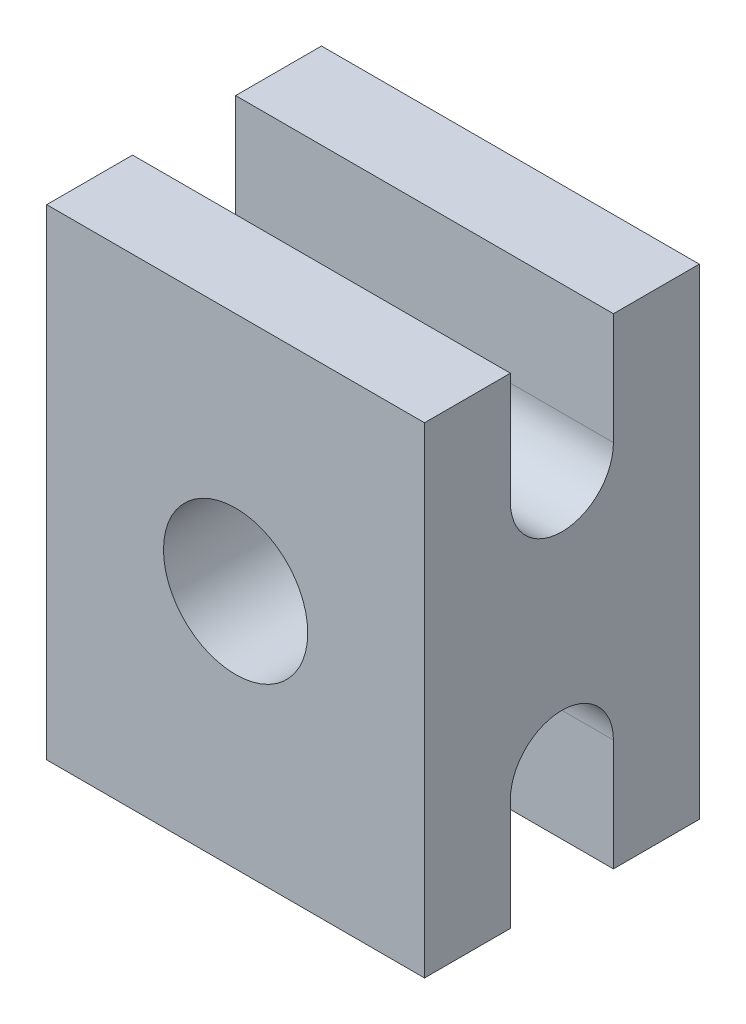
ISO-10303-21;
HEADER;
FILE_DESCRIPTION(('STEP AP214'),'2;1');
FILE_NAME('part.step','',(''),(''),'','','');
FILE_SCHEMA(('AUTOMOTIVE_DESIGN { 1 0 10303 214 1 1 1 1 }'));
ENDSEC;
DATA;
#1=APPLICATION_CONTEXT('core data for automotive mechanical design processes');
#2=APPLICATION_PROTOCOL_DEFINITION('international standard','automotive_design',2000,#1);
#3=PRODUCT_CONTEXT('',#1,'mechanical');
#4=PRODUCT('Part','Part','',(#3));
#5=PRODUCT_RELATED_PRODUCT_CATEGORY('part','',(#4));
#6=PRODUCT_DEFINITION_FORMATION('','',#4);
#7=PRODUCT_DEFINITION_CONTEXT('part definition',#1,'design');
#8=PRODUCT_DEFINITION('design','',#6,#7);
#9=PRODUCT_DEFINITION_SHAPE('','',#8);
#10=(LENGTH_UNIT() NAMED_UNIT(*) SI_UNIT(.MILLI.,.METRE.));
#11=(NAMED_UNIT(*) PLANE_ANGLE_UNIT() SI_UNIT($,.RADIAN.));
#12=(NAMED_UNIT(*) SI_UNIT($,.STERADIAN.) SOLID_ANGLE_UNIT());
#13=UNCERTAINTY_MEASURE_WITH_UNIT(LENGTH_MEASURE(1.E-05),#10,'distance_accuracy_value','');
#14=(GEOMETRIC_REPRESENTATION_CONTEXT(3) GLOBAL_UNCERTAINTY_ASSIGNED_CONTEXT((#13)) GLOBAL_UNIT_ASSIGNED_CONTEXT((#10,
#11,#12)) REPRESENTATION_CONTEXT('',''));
#15=CARTESIAN_POINT('',(0.,0.,0.));
#16=DIRECTION('',(0.,0.,1.));
#17=DIRECTION('',(1.,0.,0.));
#18=AXIS2_PLACEMENT_3D('',#15,#16,#17);
#19=CARTESIAN_POINT('',(0.,0.,8.));
#20=DIRECTION('',(0.,1.,0.));
#21=DIRECTION('',(0.,0.,1.));
#22=AXIS2_PLACEMENT_3D('',#19,#20,#21);
#23=PLANE('',#22);
#24=DIRECTION('',(0.,0.,-1.));
#25=VECTOR('',#24,1.);
#26=CARTESIAN_POINT('',(11.,0.,8.));
#27=LINE('',#26,#25);
#28=CARTESIAN_POINT('',(11.,0.,2.5));
#29=VERTEX_POINT('',#28);
#30=CARTESIAN_POINT('',(11.,0.,0.));
#31=VERTEX_POINT('',#30);
#32=EDGE_CURVE('E207',#29,#31,#27,.T.);
#33=ORIENTED_EDGE('',*,*,#32,.F.);
#34=DIRECTION('',(-1.,0.,0.));
#35=VECTOR('',#34,1.);
#36=CARTESIAN_POINT('',(0.,0.,2.5));
#37=LINE('',#36,#35);
#38=CARTESIAN_POINT('',(0.,0.,2.5));
#39=VERTEX_POINT('',#38);
#40=EDGE_CURVE('E146',#29,#39,#37,.T.);
#41=ORIENTED_EDGE('',*,*,#40,.T.);
#42=DIRECTION('',(0.,0.,-1.));
#43=VECTOR('',#42,1.);
#44=CARTESIAN_POINT('',(0.,0.,8.));
#45=LINE('',#44,#43);
#46=CARTESIAN_POINT('',(0.,0.,0.));
#47=VERTEX_POINT('',#46);
#48=EDGE_CURVE('E209',#39,#47,#45,.T.);
#49=ORIENTED_EDGE('',*,*,#48,.T.);
#50=DIRECTION('',(1.,0.,0.));
#51=VECTOR('',#50,1.);
#52=CARTESIAN_POINT('',(0.,0.,0.));
#53=LINE('',#52,#51);
#54=EDGE_CURVE('E192',#47,#31,#53,.T.);
#55=ORIENTED_EDGE('',*,*,#54,.T.);
#56=EDGE_LOOP('',(#33,#41,#49,#55));
#57=FACE_BOUND('',#56,.T.);
#58=ADVANCED_FACE('F30',(#57),#23,.F.);
#59=CARTESIAN_POINT('',(0.,14.,8.));
#60=DIRECTION('',(0.,-1.,0.));
#61=DIRECTION('',(1.,0.,0.));
#62=AXIS2_PLACEMENT_3D('',#59,#60,#61);
#63=PLANE('',#62);
#64=DIRECTION('',(0.,0.,-1.));
#65=VECTOR('',#64,1.);
#66=CARTESIAN_POINT('',(11.,14.,8.));
#67=LINE('',#66,#65);
#68=CARTESIAN_POINT('',(11.,14.,8.));
#69=VERTEX_POINT('',#68);
#70=CARTESIAN_POINT('',(11.,14.,5.5));
#71=VERTEX_POINT('',#70);
#72=EDGE_CURVE('E204',#69,#71,#67,.T.);
#73=ORIENTED_EDGE('',*,*,#72,.T.);
#74=DIRECTION('',(-1.,0.,0.));
#75=VECTOR('',#74,1.);
#76=CARTESIAN_POINT('',(0.,14.,5.5));
#77=LINE('',#76,#75);
#78=CARTESIAN_POINT('',(0.,14.,5.5));
#79=VERTEX_POINT('',#78);
#80=EDGE_CURVE('E38',#71,#79,#77,.T.);
#81=ORIENTED_EDGE('',*,*,#80,.T.);
#82=DIRECTION('',(0.,0.,-1.));
#83=VECTOR('',#82,1.);
#84=CARTESIAN_POINT('',(0.,14.,8.));
#85=LINE('',#84,#83);
#86=CARTESIAN_POINT('',(0.,14.,8.));
#87=VERTEX_POINT('',#86);
#88=EDGE_CURVE('E200',#87,#79,#85,.T.);
#89=ORIENTED_EDGE('',*,*,#88,.F.);
#90=DIRECTION('',(-1.,0.,0.));
#91=VECTOR('',#90,1.);
#92=CARTESIAN_POINT('',(0.,14.,8.));
#93=LINE('',#92,#91);
#94=EDGE_CURVE('E187',#69,#87,#93,.T.);
#95=ORIENTED_EDGE('',*,*,#94,.F.);
#96=EDGE_LOOP('',(#73,#81,#89,#95));
#97=FACE_BOUND('',#96,.T.);
#98=ADVANCED_FACE('F217',(#97),#63,.F.);
#99=CARTESIAN_POINT('',(0.,0.,8.));
#100=DIRECTION('',(0.,0.,-1.));
#101=DIRECTION('',(-1.,0.,0.));
#102=AXIS2_PLACEMENT_3D('',#99,#100,#101);
#103=PLANE('',#102);
#104=DIRECTION('',(0.,-1.,0.));
#105=VECTOR('',#104,1.);
#106=CARTESIAN_POINT('',(0.,0.,8.));
#107=LINE('',#106,#105);
#108=CARTESIAN_POINT('',(0.,0.,8.));
#109=VERTEX_POINT('',#108);
#110=EDGE_CURVE('E179',#87,#109,#107,.T.);
#111=ORIENTED_EDGE('',*,*,#110,.T.);
#112=DIRECTION('',(1.,0.,0.));
#113=VECTOR('',#112,1.);
#114=CARTESIAN_POINT('',(0.,0.,8.));
#115=LINE('',#114,#113);
#116=CARTESIAN_POINT('',(11.,0.,8.));
#117=VERTEX_POINT('',#116);
#118=EDGE_CURVE('E182',#109,#117,#115,.T.);
#119=ORIENTED_EDGE('',*,*,#118,.T.);
#120=DIRECTION('',(0.,1.,0.));
#121=VECTOR('',#120,1.);
#122=CARTESIAN_POINT('',(11.,0.,8.));
#123=LINE('',#122,#121);
#124=EDGE_CURVE('E185',#117,#69,#123,.T.);
#125=ORIENTED_EDGE('',*,*,#124,.T.);
#126=ORIENTED_EDGE('',*,*,#94,.T.);
#127=EDGE_LOOP('',(#111,#119,#125,#126));
#128=FACE_BOUND('',#127,.T.);
#129=CARTESIAN_POINT('',(5.5,7.,8.));
#130=DIRECTION('',(0.,0.,1.));
#131=DIRECTION('',(1.,0.,0.));
#132=AXIS2_PLACEMENT_3D('',#129,#130,#131);
#133=CIRCLE('',#132,2.1);
#134=CARTESIAN_POINT('',(7.6,7.,8.));
#135=VERTEX_POINT('',#134);
#136=EDGE_CURVE('E173',#135,#135,#133,.T.);
#137=ORIENTED_EDGE('',*,*,#136,.F.);
#138=EDGE_LOOP('',(#137));
#139=FACE_BOUND('',#138,.T.);
#140=ADVANCED_FACE('F227',(#128,#139),#103,.F.);
#141=CARTESIAN_POINT('',(0.,0.,0.));
#142=DIRECTION('',(0.,0.,-1.));
#143=DIRECTION('',(-1.,0.,0.));
#144=AXIS2_PLACEMENT_3D('',#141,#142,#143);
#145=PLANE('',#144);
#146=DIRECTION('',(0.,-1.,0.));
#147=VECTOR('',#146,1.);
#148=CARTESIAN_POINT('',(0.,0.,0.));
#149=LINE('',#148,#147);
#150=CARTESIAN_POINT('',(0.,14.,0.));
#151=VERTEX_POINT('',#150);
#152=EDGE_CURVE('E176',#151,#47,#149,.T.);
#153=ORIENTED_EDGE('',*,*,#152,.F.);
#154=DIRECTION('',(-1.,0.,0.));
#155=VECTOR('',#154,1.);
#156=CARTESIAN_POINT('',(0.,14.,0.));
#157=LINE('',#156,#155);
#158=CARTESIAN_POINT('',(11.,14.,0.));
#159=VERTEX_POINT('',#158);
#160=EDGE_CURVE('E183',#159,#151,#157,.T.);
#161=ORIENTED_EDGE('',*,*,#160,.F.);
#162=DIRECTION('',(0.,1.,0.));
#163=VECTOR('',#162,1.);
#164=CARTESIAN_POINT('',(11.,0.,0.));
#165=LINE('',#164,#163);
#166=EDGE_CURVE('E195',#31,#159,#165,.T.);
#167=ORIENTED_EDGE('',*,*,#166,.F.);
#168=ORIENTED_EDGE('',*,*,#54,.F.);
#169=EDGE_LOOP('',(#153,#161,#167,#168));
#170=FACE_BOUND('',#169,.T.);
#171=CARTESIAN_POINT('',(5.5,7.,0.));
#172=DIRECTION('',(0.,0.,1.));
#173=DIRECTION('',(1.,0.,0.));
#174=AXIS2_PLACEMENT_3D('',#171,#172,#173);
#175=CIRCLE('',#174,2.1);
#176=CARTESIAN_POINT('',(7.6,7.,0.));
#177=VERTEX_POINT('',#176);
#178=EDGE_CURVE('E172',#177,#177,#175,.T.);
#179=ORIENTED_EDGE('',*,*,#178,.T.);
#180=EDGE_LOOP('',(#179));
#181=FACE_BOUND('',#180,.T.);
#182=ADVANCED_FACE('F244',(#170,#181),#145,.T.);
#183=CARTESIAN_POINT('',(0.,0.,8.));
#184=DIRECTION('',(1.,0.,0.));
#185=DIRECTION('',(0.,0.,-1.));
#186=AXIS2_PLACEMENT_3D('',#183,#184,#185);
#187=PLANE('',#186);
#188=ORIENTED_EDGE('',*,*,#48,.F.);
#189=DIRECTION('',(0.,1.,0.));
#190=VECTOR('',#189,1.);
#191=CARTESIAN_POINT('',(0.,0.,2.5));
#192=LINE('',#191,#190);
#193=CARTESIAN_POINT('',(0.,3.25,2.49999999999999));
#194=VERTEX_POINT('',#193);
#195=EDGE_CURVE('E149',#39,#194,#192,.T.);
#196=ORIENTED_EDGE('',*,*,#195,.T.);
#197=CARTESIAN_POINT('',(0.,3.25,4.));
#198=DIRECTION('',(1.,0.,0.));
#199=DIRECTION('',(0.,0.,-1.));
#200=AXIS2_PLACEMENT_3D('',#197,#198,#199);
#201=CIRCLE('',#200,1.50000000000001);
#202=CARTESIAN_POINT('',(0.,3.25000024143049,5.5));
#203=VERTEX_POINT('',#202);
#204=EDGE_CURVE('E127',#194,#203,#201,.T.);
#205=ORIENTED_EDGE('',*,*,#204,.T.);
#206=DIRECTION('',(0.,-1.,0.));
#207=VECTOR('',#206,1.);
#208=CARTESIAN_POINT('',(0.,0.,5.5));
#209=LINE('',#208,#207);
#210=CARTESIAN_POINT('',(0.,0.,5.5));
#211=VERTEX_POINT('',#210);
#212=EDGE_CURVE('E125',#203,#211,#209,.T.);
#213=ORIENTED_EDGE('',*,*,#212,.T.);
#214=EDGE_CURVE('E210',#109,#211,#45,.T.);
#215=ORIENTED_EDGE('',*,*,#214,.F.);
#216=ORIENTED_EDGE('',*,*,#110,.F.);
#217=ORIENTED_EDGE('',*,*,#88,.T.);
#218=DIRECTION('',(0.,-1.,0.));
#219=VECTOR('',#218,1.);
#220=CARTESIAN_POINT('',(0.,0.,5.5));
#221=LINE('',#220,#219);
#222=CARTESIAN_POINT('',(0.,10.750000239075,5.49999999999999));
#223=VERTEX_POINT('',#222);
#224=EDGE_CURVE('E166',#79,#223,#221,.T.);
#225=ORIENTED_EDGE('',*,*,#224,.T.);
#226=CARTESIAN_POINT('',(0.,10.75,4.));
#227=DIRECTION('',(1.,0.,0.));
#228=DIRECTION('',(0.,0.,-1.));
#229=AXIS2_PLACEMENT_3D('',#226,#227,#228);
#230=CIRCLE('',#229,1.50000000000001);
#231=CARTESIAN_POINT('',(0.,10.75,2.5));
#232=VERTEX_POINT('',#231);
#233=EDGE_CURVE('E169',#223,#232,#230,.T.);
#234=ORIENTED_EDGE('',*,*,#233,.T.);
#235=DIRECTION('',(0.,1.,0.));
#236=VECTOR('',#235,1.);
#237=CARTESIAN_POINT('',(0.,0.,2.5));
#238=LINE('',#237,#236);
#239=CARTESIAN_POINT('',(0.,14.,2.5));
#240=VERTEX_POINT('',#239);
#241=EDGE_CURVE('E162',#232,#240,#238,.T.);
#242=ORIENTED_EDGE('',*,*,#241,.T.);
#243=EDGE_CURVE('E189',#240,#151,#85,.T.);
#244=ORIENTED_EDGE('',*,*,#243,.T.);
#245=ORIENTED_EDGE('',*,*,#152,.T.);
#246=EDGE_LOOP('',(#188,#196,#205,#213,#215,#216,#217,#225,#234,#242,#244,#245));
#247=FACE_BOUND('',#246,.T.);
#248=ADVANCED_FACE('F32',(#247),#187,.F.);
#249=ORIENTED_EDGE('',*,*,#214,.T.);
#250=DIRECTION('',(1.,0.,0.));
#251=VECTOR('',#250,1.);
#252=CARTESIAN_POINT('',(0.,0.,5.5));
#253=LINE('',#252,#251);
#254=CARTESIAN_POINT('',(11.,0.,5.5));
#255=VERTEX_POINT('',#254);
#256=EDGE_CURVE('E143',#211,#255,#253,.T.);
#257=ORIENTED_EDGE('',*,*,#256,.T.);
#258=EDGE_CURVE('E138',#117,#255,#27,.T.);
#259=ORIENTED_EDGE('',*,*,#258,.F.);
#260=ORIENTED_EDGE('',*,*,#118,.F.);
#261=EDGE_LOOP('',(#249,#257,#259,#260));
#262=FACE_BOUND('',#261,.T.);
#263=ADVANCED_FACE('F261',(#262),#23,.F.);
#264=CARTESIAN_POINT('',(11.,0.,8.));
#265=DIRECTION('',(-1.,0.,0.));
#266=DIRECTION('',(0.,0.,1.));
#267=AXIS2_PLACEMENT_3D('',#264,#265,#266);
#268=PLANE('',#267);
#269=CARTESIAN_POINT('',(11.,3.25,4.));
#270=DIRECTION('',(1.,0.,0.));
#271=DIRECTION('',(0.,0.,1.));
#272=AXIS2_PLACEMENT_3D('',#269,#270,#271);
#273=CIRCLE('',#272,1.50000000000001);
#274=CARTESIAN_POINT('',(11.,3.25,2.49999999999999));
#275=VERTEX_POINT('',#274);
#276=CARTESIAN_POINT('',(11.,3.25000024143049,5.5));
#277=VERTEX_POINT('',#276);
#278=EDGE_CURVE('E130',#275,#277,#273,.T.);
#279=ORIENTED_EDGE('',*,*,#278,.F.);
#280=DIRECTION('',(0.,-1.,0.));
#281=VECTOR('',#280,1.);
#282=CARTESIAN_POINT('',(11.,0.,2.5));
#283=LINE('',#282,#281);
#284=EDGE_CURVE('E11',#275,#29,#283,.T.);
#285=ORIENTED_EDGE('',*,*,#284,.T.);
#286=ORIENTED_EDGE('',*,*,#32,.T.);
#287=ORIENTED_EDGE('',*,*,#166,.T.);
#288=CARTESIAN_POINT('',(11.,14.,2.49999999999999));
#289=VERTEX_POINT('',#288);
#290=EDGE_CURVE('E203',#289,#159,#67,.T.);
#291=ORIENTED_EDGE('',*,*,#290,.F.);
#292=DIRECTION('',(0.,1.,0.));
#293=VECTOR('',#292,1.);
#294=CARTESIAN_POINT('',(11.,15.2427133015369,2.5));
#295=LINE('',#294,#293);
#296=CARTESIAN_POINT('',(11.,10.75,2.5));
#297=VERTEX_POINT('',#296);
#298=EDGE_CURVE('E53',#297,#289,#295,.T.);
#299=ORIENTED_EDGE('',*,*,#298,.F.);
#300=CARTESIAN_POINT('',(11.,10.75,4.));
#301=DIRECTION('',(1.,0.,0.));
#302=DIRECTION('',(0.,0.,-1.));
#303=AXIS2_PLACEMENT_3D('',#300,#301,#302);
#304=CIRCLE('',#303,1.50000000000001);
#305=CARTESIAN_POINT('',(11.,10.750000239075,5.49999999999999));
#306=VERTEX_POINT('',#305);
#307=EDGE_CURVE('E155',#306,#297,#304,.T.);
#308=ORIENTED_EDGE('',*,*,#307,.F.);
#309=DIRECTION('',(0.,-1.,0.));
#310=VECTOR('',#309,1.);
#311=CARTESIAN_POINT('',(11.,15.2427133015369,5.5));
#312=LINE('',#311,#310);
#313=EDGE_CURVE('E152',#71,#306,#312,.T.);
#314=ORIENTED_EDGE('',*,*,#313,.F.);
#315=ORIENTED_EDGE('',*,*,#72,.F.);
#316=ORIENTED_EDGE('',*,*,#124,.F.);
#317=ORIENTED_EDGE('',*,*,#258,.T.);
#318=DIRECTION('',(0.,-1.,0.));
#319=VECTOR('',#318,1.);
#320=CARTESIAN_POINT('',(11.,3.25000024143049,5.5));
#321=LINE('',#320,#319);
#322=EDGE_CURVE('E122',#277,#255,#321,.T.);
#323=ORIENTED_EDGE('',*,*,#322,.F.);
#324=EDGE_LOOP('',(#279,#285,#286,#287,#291,#299,#308,#314,#315,#316,#317,#323));
#325=FACE_BOUND('',#324,.T.);
#326=ADVANCED_FACE('F135',(#325),#268,.F.);
#327=ORIENTED_EDGE('',*,*,#243,.F.);
#328=DIRECTION('',(1.,0.,0.));
#329=VECTOR('',#328,1.);
#330=CARTESIAN_POINT('',(0.,14.,2.5));
#331=LINE('',#330,#329);
#332=EDGE_CURVE('E213',#240,#289,#331,.T.);
#333=ORIENTED_EDGE('',*,*,#332,.T.);
#334=ORIENTED_EDGE('',*,*,#290,.T.);
#335=ORIENTED_EDGE('',*,*,#160,.T.);
#336=EDGE_LOOP('',(#327,#333,#334,#335));
#337=FACE_BOUND('',#336,.T.);
#338=ADVANCED_FACE('F237',(#337),#63,.F.);
#339=CARTESIAN_POINT('',(5.5,7.,8.));
#340=DIRECTION('',(0.,0.,-1.));
#341=DIRECTION('',(-1.,0.,0.));
#342=AXIS2_PLACEMENT_3D('',#339,#340,#341);
#343=CYLINDRICAL_SURFACE('',#342,2.1);
#344=ORIENTED_EDGE('',*,*,#136,.T.);
#345=EDGE_LOOP('',(#344));
#346=FACE_BOUND('',#345,.T.);
#347=ORIENTED_EDGE('',*,*,#178,.F.);
#348=EDGE_LOOP('',(#347));
#349=FACE_BOUND('',#348,.T.);
#350=ADVANCED_FACE('F283',(#346,#349),#343,.F.);
#351=CARTESIAN_POINT('',(-7.,10.75,4.));
#352=DIRECTION('',(1.,0.,0.));
#353=DIRECTION('',(0.,0.,-1.));
#354=AXIS2_PLACEMENT_3D('',#351,#352,#353);
#355=CYLINDRICAL_SURFACE('',#354,1.50000000000001);
#356=DIRECTION('',(1.,0.,0.));
#357=VECTOR('',#356,1.);
#358=CARTESIAN_POINT('',(-7.,10.750000239075,5.49999999999999));
#359=LINE('',#358,#357);
#360=EDGE_CURVE('E159',#223,#306,#359,.T.);
#361=ORIENTED_EDGE('',*,*,#360,.T.);
#362=ORIENTED_EDGE('',*,*,#307,.T.);
#363=DIRECTION('',(1.,0.,0.));
#364=VECTOR('',#363,1.);
#365=CARTESIAN_POINT('',(-7.,10.75,2.5));
#366=LINE('',#365,#364);
#367=EDGE_CURVE('E160',#232,#297,#366,.T.);
#368=ORIENTED_EDGE('',*,*,#367,.F.);
#369=ORIENTED_EDGE('',*,*,#233,.F.);
#370=EDGE_LOOP('',(#361,#362,#368,#369));
#371=FACE_BOUND('',#370,.T.);
#372=ADVANCED_FACE('F233',(#371),#355,.F.);
#373=CARTESIAN_POINT('',(-7.,15.2427133015369,5.5));
#374=DIRECTION('',(0.,0.,1.));
#375=DIRECTION('',(1.,0.,0.));
#376=AXIS2_PLACEMENT_3D('',#373,#374,#375);
#377=PLANE('',#376);
#378=ORIENTED_EDGE('',*,*,#80,.F.);
#379=ORIENTED_EDGE('',*,*,#313,.T.);
#380=ORIENTED_EDGE('',*,*,#360,.F.);
#381=ORIENTED_EDGE('',*,*,#224,.F.);
#382=EDGE_LOOP('',(#378,#379,#380,#381));
#383=FACE_BOUND('',#382,.T.);
#384=ADVANCED_FACE('F231',(#383),#377,.F.);
#385=CARTESIAN_POINT('',(-7.,15.2427133015369,2.5));
#386=DIRECTION('',(0.,0.,-1.));
#387=DIRECTION('',(0.,1.,0.));
#388=AXIS2_PLACEMENT_3D('',#385,#386,#387);
#389=PLANE('',#388);
#390=ORIENTED_EDGE('',*,*,#367,.T.);
#391=ORIENTED_EDGE('',*,*,#298,.T.);
#392=ORIENTED_EDGE('',*,*,#332,.F.);
#393=ORIENTED_EDGE('',*,*,#241,.F.);
#394=EDGE_LOOP('',(#390,#391,#392,#393));
#395=FACE_BOUND('',#394,.T.);
#396=ADVANCED_FACE('F251',(#395),#389,.F.);
#397=CARTESIAN_POINT('',(-7.,3.25,2.5));
#398=DIRECTION('',(0.,0.,-1.));
#399=DIRECTION('',(0.,1.,0.));
#400=AXIS2_PLACEMENT_3D('',#397,#398,#399);
#401=PLANE('',#400);
#402=ORIENTED_EDGE('',*,*,#40,.F.);
#403=ORIENTED_EDGE('',*,*,#284,.F.);
#404=DIRECTION('',(1.,0.,0.));
#405=VECTOR('',#404,1.);
#406=CARTESIAN_POINT('',(-7.,3.25,2.49999999999999));
#407=LINE('',#406,#405);
#408=EDGE_CURVE('E45',#194,#275,#407,.T.);
#409=ORIENTED_EDGE('',*,*,#408,.F.);
#410=ORIENTED_EDGE('',*,*,#195,.F.);
#411=EDGE_LOOP('',(#402,#403,#409,#410));
#412=FACE_BOUND('',#411,.T.);
#413=ADVANCED_FACE('F249',(#412),#401,.F.);
#414=CARTESIAN_POINT('',(-7.,3.25000024143049,5.5));
#415=DIRECTION('',(0.,0.,1.));
#416=DIRECTION('',(0.,-1.,0.));
#417=AXIS2_PLACEMENT_3D('',#414,#415,#416);
#418=PLANE('',#417);
#419=DIRECTION('',(1.,0.,0.));
#420=VECTOR('',#419,1.);
#421=CARTESIAN_POINT('',(-7.,3.25000024143049,5.5));
#422=LINE('',#421,#420);
#423=EDGE_CURVE('E119',#203,#277,#422,.T.);
#424=ORIENTED_EDGE('',*,*,#423,.T.);
#425=ORIENTED_EDGE('',*,*,#322,.T.);
#426=ORIENTED_EDGE('',*,*,#256,.F.);
#427=ORIENTED_EDGE('',*,*,#212,.F.);
#428=EDGE_LOOP('',(#424,#425,#426,#427));
#429=FACE_BOUND('',#428,.T.);
#430=ADVANCED_FACE('F120',(#429),#418,.F.);
#431=CARTESIAN_POINT('',(-7.,3.25,4.));
#432=DIRECTION('',(1.,0.,0.));
#433=DIRECTION('',(0.,0.,-1.));
#434=AXIS2_PLACEMENT_3D('',#431,#432,#433);
#435=CYLINDRICAL_SURFACE('',#434,1.50000000000001);
#436=ORIENTED_EDGE('',*,*,#408,.T.);
#437=ORIENTED_EDGE('',*,*,#278,.T.);
#438=ORIENTED_EDGE('',*,*,#423,.F.);
#439=ORIENTED_EDGE('',*,*,#204,.F.);
#440=EDGE_LOOP('',(#436,#437,#438,#439));
#441=FACE_BOUND('',#440,.T.);
#442=ADVANCED_FACE('F131',(#441),#435,.F.);
#443=CLOSED_SHELL('',(#58,#98,#140,#182,#248,#263,#326,#338,#350,#372,#384,#396,#413,#430,#442));
#444=MANIFOLD_SOLID_BREP('B2',#443);
#445=ADVANCED_BREP_SHAPE_REPRESENTATION('',(#18,#444),#14);
#446=SHAPE_DEFINITION_REPRESENTATION(#9,#445);
ENDSEC;
END-ISO-10303-21;
